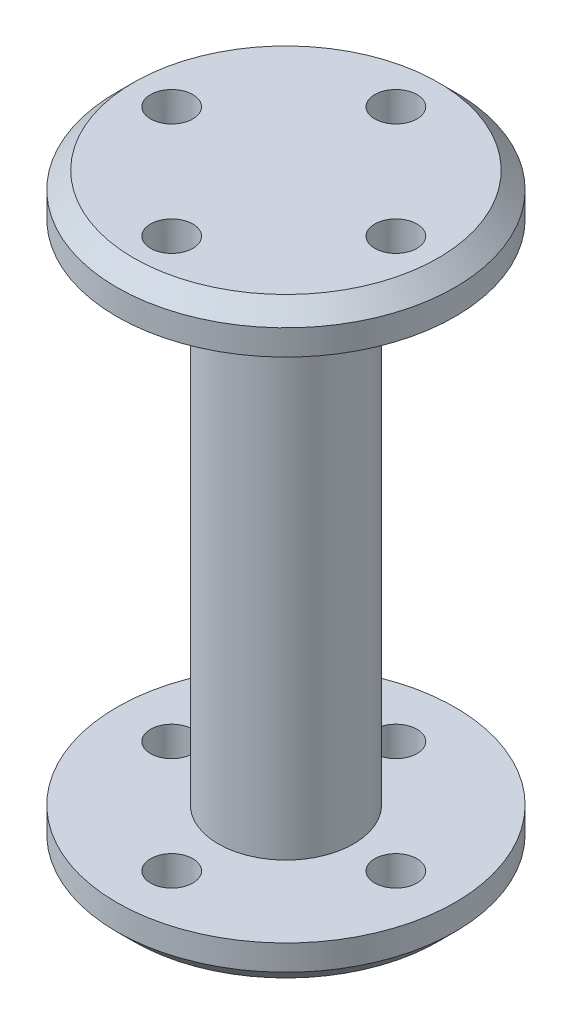
ISO-10303-21;
HEADER;
FILE_DESCRIPTION(('STEP AP214'),'2;1');
FILE_NAME('part.step','',(''),(''),'','','');
FILE_SCHEMA(('AUTOMOTIVE_DESIGN { 1 0 10303 214 1 1 1 1 }'));
ENDSEC;
DATA;
#1=APPLICATION_CONTEXT('core data for automotive mechanical design processes');
#2=APPLICATION_PROTOCOL_DEFINITION('international standard','automotive_design',2000,#1);
#3=PRODUCT_CONTEXT('',#1,'mechanical');
#4=PRODUCT('Part','Part','',(#3));
#5=PRODUCT_RELATED_PRODUCT_CATEGORY('part','',(#4));
#6=PRODUCT_DEFINITION_FORMATION('','',#4);
#7=PRODUCT_DEFINITION_CONTEXT('part definition',#1,'design');
#8=PRODUCT_DEFINITION('design','',#6,#7);
#9=PRODUCT_DEFINITION_SHAPE('','',#8);
#10=(LENGTH_UNIT() NAMED_UNIT(*) SI_UNIT(.MILLI.,.METRE.));
#11=(NAMED_UNIT(*) PLANE_ANGLE_UNIT() SI_UNIT($,.RADIAN.));
#12=(NAMED_UNIT(*) SI_UNIT($,.STERADIAN.) SOLID_ANGLE_UNIT());
#13=UNCERTAINTY_MEASURE_WITH_UNIT(LENGTH_MEASURE(1.E-05),#10,'distance_accuracy_value','');
#14=(GEOMETRIC_REPRESENTATION_CONTEXT(3) GLOBAL_UNCERTAINTY_ASSIGNED_CONTEXT((#13)) GLOBAL_UNIT_ASSIGNED_CONTEXT((#10,
#11,#12)) REPRESENTATION_CONTEXT('',''));
#15=CARTESIAN_POINT('',(0.,0.,0.));
#16=DIRECTION('',(0.,0.,1.));
#17=DIRECTION('',(1.,0.,0.));
#18=AXIS2_PLACEMENT_3D('',#15,#16,#17);
#19=CARTESIAN_POINT('',(0.,30.,0.));
#20=DIRECTION('',(0.,-1.,0.));
#21=DIRECTION('',(0.,0.,-1.));
#22=AXIS2_PLACEMENT_3D('',#19,#20,#21);
#23=CYLINDRICAL_SURFACE('',#22,8.);
#24=CARTESIAN_POINT('',(0.,30.,0.));
#25=DIRECTION('',(0.,1.,0.));
#26=DIRECTION('',(0.,0.,1.));
#27=AXIS2_PLACEMENT_3D('',#24,#25,#26);
#28=CIRCLE('',#27,8.);
#29=CARTESIAN_POINT('',(0.,30.,8.));
#30=VERTEX_POINT('',#29);
#31=EDGE_CURVE('E52',#30,#30,#28,.T.);
#32=ORIENTED_EDGE('',*,*,#31,.F.);
#33=EDGE_LOOP('',(#32));
#34=FACE_BOUND('',#33,.T.);
#35=CARTESIAN_POINT('',(0.,-30.,0.));
#36=DIRECTION('',(0.,1.,0.));
#37=DIRECTION('',(0.,0.,1.));
#38=AXIS2_PLACEMENT_3D('',#35,#36,#37);
#39=CIRCLE('',#38,8.);
#40=CARTESIAN_POINT('',(0.,-30.,8.));
#41=VERTEX_POINT('',#40);
#42=EDGE_CURVE('E98',#41,#41,#39,.T.);
#43=ORIENTED_EDGE('',*,*,#42,.T.);
#44=EDGE_LOOP('',(#43));
#45=FACE_BOUND('',#44,.T.);
#46=ADVANCED_FACE('F37',(#34,#45),#23,.T.);
#47=CARTESIAN_POINT('',(0.,35.,0.));
#48=DIRECTION('',(0.,-1.,0.));
#49=DIRECTION('',(0.,0.,-1.));
#50=AXIS2_PLACEMENT_3D('',#47,#48,#49);
#51=CYLINDRICAL_SURFACE('',#50,20.);
#52=CARTESIAN_POINT('',(0.,33.,0.));
#53=DIRECTION('',(0.,1.,0.));
#54=DIRECTION('',(0.,0.,1.));
#55=AXIS2_PLACEMENT_3D('',#52,#53,#54);
#56=CIRCLE('',#55,20.);
#57=CARTESIAN_POINT('',(0.,33.,20.));
#58=VERTEX_POINT('',#57);
#59=EDGE_CURVE('E10',#58,#58,#56,.F.);
#60=ORIENTED_EDGE('',*,*,#59,.T.);
#61=EDGE_LOOP('',(#60));
#62=FACE_BOUND('',#61,.T.);
#63=CARTESIAN_POINT('',(0.,30.,0.));
#64=DIRECTION('',(0.,1.,0.));
#65=DIRECTION('',(0.,0.,1.));
#66=AXIS2_PLACEMENT_3D('',#63,#64,#65);
#67=CIRCLE('',#66,20.);
#68=CARTESIAN_POINT('',(0.,30.,20.));
#69=VERTEX_POINT('',#68);
#70=EDGE_CURVE('E60',#69,#69,#67,.T.);
#71=ORIENTED_EDGE('',*,*,#70,.T.);
#72=EDGE_LOOP('',(#71));
#73=FACE_BOUND('',#72,.T.);
#74=ADVANCED_FACE('F95',(#62,#73),#51,.T.);
#75=CARTESIAN_POINT('',(0.,35.,0.));
#76=DIRECTION('',(0.,1.,0.));
#77=DIRECTION('',(0.,0.,1.));
#78=AXIS2_PLACEMENT_3D('',#75,#76,#77);
#79=PLANE('',#78);
#80=CARTESIAN_POINT('',(-13.2557041699449,35.,0.255704169944971));
#81=DIRECTION('',(0.,1.,0.));
#82=DIRECTION('',(1.,0.,0.));
#83=AXIS2_PLACEMENT_3D('',#80,#81,#82);
#84=CIRCLE('',#83,2.5);
#85=CARTESIAN_POINT('',(-10.7557041699449,35.,0.255704169944962));
#86=VERTEX_POINT('',#85);
#87=EDGE_CURVE('E66',#86,#86,#84,.T.);
#88=ORIENTED_EDGE('',*,*,#87,.F.);
#89=EDGE_LOOP('',(#88));
#90=FACE_BOUND('',#89,.T.);
#91=CARTESIAN_POINT('',(0.,35.,13.5114083398898));
#92=DIRECTION('',(0.,1.,0.));
#93=DIRECTION('',(0.,0.,-1.));
#94=AXIS2_PLACEMENT_3D('',#91,#92,#93);
#95=CIRCLE('',#94,2.5);
#96=CARTESIAN_POINT('',(0.,35.,11.0114083398898));
#97=VERTEX_POINT('',#96);
#98=EDGE_CURVE('E136',#97,#97,#95,.T.);
#99=ORIENTED_EDGE('',*,*,#98,.F.);
#100=EDGE_LOOP('',(#99));
#101=FACE_BOUND('',#100,.T.);
#102=CARTESIAN_POINT('',(13.2557041699449,35.,0.25570416994479));
#103=DIRECTION('',(0.,1.,0.));
#104=DIRECTION('',(-1.,0.,0.));
#105=AXIS2_PLACEMENT_3D('',#102,#103,#104);
#106=CIRCLE('',#105,2.5);
#107=CARTESIAN_POINT('',(10.7557041699449,35.,0.255704169944816));
#108=VERTEX_POINT('',#107);
#109=EDGE_CURVE('E82',#108,#108,#106,.T.);
#110=ORIENTED_EDGE('',*,*,#109,.F.);
#111=EDGE_LOOP('',(#110));
#112=FACE_BOUND('',#111,.T.);
#113=CARTESIAN_POINT('',(0.,35.,-13.));
#114=DIRECTION('',(0.,1.,0.));
#115=DIRECTION('',(0.,0.,1.));
#116=AXIS2_PLACEMENT_3D('',#113,#114,#115);
#117=CIRCLE('',#116,2.5);
#118=CARTESIAN_POINT('',(0.,35.,-10.5));
#119=VERTEX_POINT('',#118);
#120=EDGE_CURVE('E61',#119,#119,#117,.T.);
#121=ORIENTED_EDGE('',*,*,#120,.F.);
#122=EDGE_LOOP('',(#121));
#123=FACE_BOUND('',#122,.T.);
#124=CARTESIAN_POINT('',(0.,35.,0.));
#125=DIRECTION('',(0.,1.,0.));
#126=DIRECTION('',(0.,0.,1.));
#127=AXIS2_PLACEMENT_3D('',#124,#125,#126);
#128=CIRCLE('',#127,18.);
#129=CARTESIAN_POINT('',(0.,35.,18.));
#130=VERTEX_POINT('',#129);
#131=EDGE_CURVE('E46',#130,#130,#128,.T.);
#132=ORIENTED_EDGE('',*,*,#131,.T.);
#133=EDGE_LOOP('',(#132));
#134=FACE_BOUND('',#133,.T.);
#135=ADVANCED_FACE('F148',(#90,#101,#112,#123,#134),#79,.T.);
#136=CARTESIAN_POINT('',(0.,30.,0.));
#137=DIRECTION('',(0.,1.,0.));
#138=DIRECTION('',(0.,0.,1.));
#139=AXIS2_PLACEMENT_3D('',#136,#137,#138);
#140=PLANE('',#139);
#141=CARTESIAN_POINT('',(-13.2557041699449,30.,0.255704169944971));
#142=DIRECTION('',(0.,1.,0.));
#143=DIRECTION('',(0.,0.,1.));
#144=AXIS2_PLACEMENT_3D('',#141,#142,#143);
#145=CIRCLE('',#144,2.5);
#146=CARTESIAN_POINT('',(-13.2557041699449,30.,2.75570416994498));
#147=VERTEX_POINT('',#146);
#148=EDGE_CURVE('E41',#147,#147,#145,.T.);
#149=ORIENTED_EDGE('',*,*,#148,.T.);
#150=EDGE_LOOP('',(#149));
#151=FACE_BOUND('',#150,.T.);
#152=CARTESIAN_POINT('',(0.,30.,13.5114083398898));
#153=DIRECTION('',(0.,1.,0.));
#154=DIRECTION('',(0.,0.,1.));
#155=AXIS2_PLACEMENT_3D('',#152,#153,#154);
#156=CIRCLE('',#155,2.5);
#157=CARTESIAN_POINT('',(0.,30.,16.0114083398898));
#158=VERTEX_POINT('',#157);
#159=EDGE_CURVE('E65',#158,#158,#156,.T.);
#160=ORIENTED_EDGE('',*,*,#159,.T.);
#161=EDGE_LOOP('',(#160));
#162=FACE_BOUND('',#161,.T.);
#163=CARTESIAN_POINT('',(13.2557041699449,30.,0.25570416994479));
#164=DIRECTION('',(0.,1.,0.));
#165=DIRECTION('',(0.,0.,1.));
#166=AXIS2_PLACEMENT_3D('',#163,#164,#165);
#167=CIRCLE('',#166,2.5);
#168=CARTESIAN_POINT('',(13.2557041699449,30.,2.75570416994479));
#169=VERTEX_POINT('',#168);
#170=EDGE_CURVE('E62',#169,#169,#167,.T.);
#171=ORIENTED_EDGE('',*,*,#170,.T.);
#172=EDGE_LOOP('',(#171));
#173=FACE_BOUND('',#172,.T.);
#174=CARTESIAN_POINT('',(0.,30.,-13.));
#175=DIRECTION('',(0.,1.,0.));
#176=DIRECTION('',(0.,0.,1.));
#177=AXIS2_PLACEMENT_3D('',#174,#175,#176);
#178=CIRCLE('',#177,2.5);
#179=CARTESIAN_POINT('',(0.,30.,-10.5));
#180=VERTEX_POINT('',#179);
#181=EDGE_CURVE('E56',#180,#180,#178,.T.);
#182=ORIENTED_EDGE('',*,*,#181,.T.);
#183=EDGE_LOOP('',(#182));
#184=FACE_BOUND('',#183,.T.);
#185=ORIENTED_EDGE('',*,*,#31,.T.);
#186=EDGE_LOOP('',(#185));
#187=FACE_BOUND('',#186,.T.);
#188=ORIENTED_EDGE('',*,*,#70,.F.);
#189=EDGE_LOOP('',(#188));
#190=FACE_BOUND('',#189,.T.);
#191=ADVANCED_FACE('F90',(#151,#162,#173,#184,#187,#190),#140,.F.);
#192=CARTESIAN_POINT('',(0.,35.,0.));
#193=DIRECTION('',(0.,-1.,0.));
#194=DIRECTION('',(0.,0.,-1.));
#195=AXIS2_PLACEMENT_3D('',#192,#193,#194);
#196=CONICAL_SURFACE('',#195,18.,0.785398163397447);
#197=ORIENTED_EDGE('',*,*,#59,.F.);
#198=EDGE_LOOP('',(#197));
#199=FACE_BOUND('',#198,.T.);
#200=ORIENTED_EDGE('',*,*,#131,.F.);
#201=EDGE_LOOP('',(#200));
#202=FACE_BOUND('',#201,.T.);
#203=ADVANCED_FACE('F39',(#199,#202),#196,.T.);
#204=CARTESIAN_POINT('',(0.,-30.,-13.));
#205=DIRECTION('',(0.,1.,0.));
#206=DIRECTION('',(0.,0.,1.));
#207=AXIS2_PLACEMENT_3D('',#204,#205,#206);
#208=CYLINDRICAL_SURFACE('',#207,2.5);
#209=ORIENTED_EDGE('',*,*,#120,.T.);
#210=EDGE_LOOP('',(#209));
#211=FACE_BOUND('',#210,.T.);
#212=ORIENTED_EDGE('',*,*,#181,.F.);
#213=EDGE_LOOP('',(#212));
#214=FACE_BOUND('',#213,.T.);
#215=ADVANCED_FACE('F157',(#211,#214),#208,.F.);
#216=CARTESIAN_POINT('',(13.2557041699449,-30.,0.25570416994479));
#217=DIRECTION('',(0.,1.,0.));
#218=DIRECTION('',(0.,0.,1.));
#219=AXIS2_PLACEMENT_3D('',#216,#217,#218);
#220=CYLINDRICAL_SURFACE('',#219,2.5);
#221=ORIENTED_EDGE('',*,*,#109,.T.);
#222=EDGE_LOOP('',(#221));
#223=FACE_BOUND('',#222,.T.);
#224=ORIENTED_EDGE('',*,*,#170,.F.);
#225=EDGE_LOOP('',(#224));
#226=FACE_BOUND('',#225,.T.);
#227=ADVANCED_FACE('F145',(#223,#226),#220,.F.);
#228=CARTESIAN_POINT('',(0.,-30.,13.5114083398898));
#229=DIRECTION('',(0.,1.,0.));
#230=DIRECTION('',(0.,0.,1.));
#231=AXIS2_PLACEMENT_3D('',#228,#229,#230);
#232=CYLINDRICAL_SURFACE('',#231,2.5);
#233=ORIENTED_EDGE('',*,*,#98,.T.);
#234=EDGE_LOOP('',(#233));
#235=FACE_BOUND('',#234,.T.);
#236=ORIENTED_EDGE('',*,*,#159,.F.);
#237=EDGE_LOOP('',(#236));
#238=FACE_BOUND('',#237,.T.);
#239=ADVANCED_FACE('F199',(#235,#238),#232,.F.);
#240=CARTESIAN_POINT('',(-13.2557041699449,-30.,0.255704169944971));
#241=DIRECTION('',(0.,1.,0.));
#242=DIRECTION('',(0.,0.,1.));
#243=AXIS2_PLACEMENT_3D('',#240,#241,#242);
#244=CYLINDRICAL_SURFACE('',#243,2.5);
#245=ORIENTED_EDGE('',*,*,#87,.T.);
#246=EDGE_LOOP('',(#245));
#247=FACE_BOUND('',#246,.T.);
#248=ORIENTED_EDGE('',*,*,#148,.F.);
#249=EDGE_LOOP('',(#248));
#250=FACE_BOUND('',#249,.T.);
#251=ADVANCED_FACE('F208',(#247,#250),#244,.F.);
#252=CARTESIAN_POINT('',(0.,-35.,0.));
#253=DIRECTION('',(0.,1.,0.));
#254=DIRECTION('',(0.,0.,-1.));
#255=AXIS2_PLACEMENT_3D('',#252,#253,#254);
#256=CYLINDRICAL_SURFACE('',#255,20.);
#257=CARTESIAN_POINT('',(0.,-33.,0.));
#258=DIRECTION('',(0.,1.,0.));
#259=DIRECTION('',(0.,0.,1.));
#260=AXIS2_PLACEMENT_3D('',#257,#258,#259);
#261=CIRCLE('',#260,20.);
#262=CARTESIAN_POINT('',(0.,-33.,20.));
#263=VERTEX_POINT('',#262);
#264=EDGE_CURVE('E107',#263,#263,#261,.F.);
#265=ORIENTED_EDGE('',*,*,#264,.F.);
#266=EDGE_LOOP('',(#265));
#267=FACE_BOUND('',#266,.T.);
#268=CARTESIAN_POINT('',(0.,-30.,0.));
#269=DIRECTION('',(0.,1.,0.));
#270=DIRECTION('',(0.,0.,1.));
#271=AXIS2_PLACEMENT_3D('',#268,#269,#270);
#272=CIRCLE('',#271,20.);
#273=CARTESIAN_POINT('',(0.,-30.,20.));
#274=VERTEX_POINT('',#273);
#275=EDGE_CURVE('E102',#274,#274,#272,.T.);
#276=ORIENTED_EDGE('',*,*,#275,.F.);
#277=EDGE_LOOP('',(#276));
#278=FACE_BOUND('',#277,.T.);
#279=ADVANCED_FACE('F216',(#267,#278),#256,.T.);
#280=CARTESIAN_POINT('',(0.,-35.,0.));
#281=DIRECTION('',(0.,-1.,0.));
#282=DIRECTION('',(0.,0.,1.));
#283=AXIS2_PLACEMENT_3D('',#280,#281,#282);
#284=PLANE('',#283);
#285=CARTESIAN_POINT('',(-13.2557041699449,-35.,0.255704169944971));
#286=DIRECTION('',(0.,1.,0.));
#287=DIRECTION('',(1.,0.,0.));
#288=AXIS2_PLACEMENT_3D('',#285,#286,#287);
#289=CIRCLE('',#288,2.5);
#290=CARTESIAN_POINT('',(-10.7557041699449,-35.,0.255704169944962));
#291=VERTEX_POINT('',#290);
#292=EDGE_CURVE('E126',#291,#291,#289,.T.);
#293=ORIENTED_EDGE('',*,*,#292,.T.);
#294=EDGE_LOOP('',(#293));
#295=FACE_BOUND('',#294,.T.);
#296=CARTESIAN_POINT('',(0.,-35.,13.5114083398898));
#297=DIRECTION('',(0.,1.,0.));
#298=DIRECTION('',(0.,0.,-1.));
#299=AXIS2_PLACEMENT_3D('',#296,#297,#298);
#300=CIRCLE('',#299,2.5);
#301=CARTESIAN_POINT('',(0.,-35.,11.0114083398898));
#302=VERTEX_POINT('',#301);
#303=EDGE_CURVE('E321',#302,#302,#300,.T.);
#304=ORIENTED_EDGE('',*,*,#303,.T.);
#305=EDGE_LOOP('',(#304));
#306=FACE_BOUND('',#305,.T.);
#307=CARTESIAN_POINT('',(13.2557041699449,-35.,0.25570416994479));
#308=DIRECTION('',(0.,1.,0.));
#309=DIRECTION('',(-1.,0.,0.));
#310=AXIS2_PLACEMENT_3D('',#307,#308,#309);
#311=CIRCLE('',#310,2.5);
#312=CARTESIAN_POINT('',(10.7557041699449,-35.,0.255704169944816));
#313=VERTEX_POINT('',#312);
#314=EDGE_CURVE('E325',#313,#313,#311,.T.);
#315=ORIENTED_EDGE('',*,*,#314,.T.);
#316=EDGE_LOOP('',(#315));
#317=FACE_BOUND('',#316,.T.);
#318=CARTESIAN_POINT('',(0.,-35.,-13.));
#319=DIRECTION('',(0.,1.,0.));
#320=DIRECTION('',(0.,0.,1.));
#321=AXIS2_PLACEMENT_3D('',#318,#319,#320);
#322=CIRCLE('',#321,2.5);
#323=CARTESIAN_POINT('',(0.,-35.,-10.5));
#324=VERTEX_POINT('',#323);
#325=EDGE_CURVE('E120',#324,#324,#322,.T.);
#326=ORIENTED_EDGE('',*,*,#325,.T.);
#327=EDGE_LOOP('',(#326));
#328=FACE_BOUND('',#327,.T.);
#329=CARTESIAN_POINT('',(0.,-35.,0.));
#330=DIRECTION('',(0.,1.,0.));
#331=DIRECTION('',(0.,0.,1.));
#332=AXIS2_PLACEMENT_3D('',#329,#330,#331);
#333=CIRCLE('',#332,18.);
#334=CARTESIAN_POINT('',(0.,-35.,18.));
#335=VERTEX_POINT('',#334);
#336=EDGE_CURVE('E101',#335,#335,#333,.T.);
#337=ORIENTED_EDGE('',*,*,#336,.F.);
#338=EDGE_LOOP('',(#337));
#339=FACE_BOUND('',#338,.T.);
#340=ADVANCED_FACE('F231',(#295,#306,#317,#328,#339),#284,.T.);
#341=CARTESIAN_POINT('',(0.,-30.,0.));
#342=DIRECTION('',(0.,-1.,0.));
#343=DIRECTION('',(0.,0.,1.));
#344=AXIS2_PLACEMENT_3D('',#341,#342,#343);
#345=PLANE('',#344);
#346=CARTESIAN_POINT('',(-13.2557041699449,-30.,0.255704169944971));
#347=DIRECTION('',(0.,1.,0.));
#348=DIRECTION('',(0.,0.,1.));
#349=AXIS2_PLACEMENT_3D('',#346,#347,#348);
#350=CIRCLE('',#349,2.5);
#351=CARTESIAN_POINT('',(-13.2557041699449,-30.,2.75570416994498));
#352=VERTEX_POINT('',#351);
#353=EDGE_CURVE('E130',#352,#352,#350,.T.);
#354=ORIENTED_EDGE('',*,*,#353,.F.);
#355=EDGE_LOOP('',(#354));
#356=FACE_BOUND('',#355,.T.);
#357=CARTESIAN_POINT('',(0.,-30.,13.5114083398898));
#358=DIRECTION('',(0.,1.,0.));
#359=DIRECTION('',(0.,0.,1.));
#360=AXIS2_PLACEMENT_3D('',#357,#358,#359);
#361=CIRCLE('',#360,2.5);
#362=CARTESIAN_POINT('',(0.,-30.,16.0114083398898));
#363=VERTEX_POINT('',#362);
#364=EDGE_CURVE('E125',#363,#363,#361,.T.);
#365=ORIENTED_EDGE('',*,*,#364,.F.);
#366=EDGE_LOOP('',(#365));
#367=FACE_BOUND('',#366,.T.);
#368=CARTESIAN_POINT('',(13.2557041699449,-30.,0.25570416994479));
#369=DIRECTION('',(0.,1.,0.));
#370=DIRECTION('',(0.,0.,1.));
#371=AXIS2_PLACEMENT_3D('',#368,#369,#370);
#372=CIRCLE('',#371,2.5);
#373=CARTESIAN_POINT('',(13.2557041699449,-30.,2.75570416994479));
#374=VERTEX_POINT('',#373);
#375=EDGE_CURVE('E121',#374,#374,#372,.T.);
#376=ORIENTED_EDGE('',*,*,#375,.F.);
#377=EDGE_LOOP('',(#376));
#378=FACE_BOUND('',#377,.T.);
#379=CARTESIAN_POINT('',(0.,-30.,-13.));
#380=DIRECTION('',(0.,1.,0.));
#381=DIRECTION('',(0.,0.,1.));
#382=AXIS2_PLACEMENT_3D('',#379,#380,#381);
#383=CIRCLE('',#382,2.5);
#384=CARTESIAN_POINT('',(0.,-30.,-10.5));
#385=VERTEX_POINT('',#384);
#386=EDGE_CURVE('E110',#385,#385,#383,.T.);
#387=ORIENTED_EDGE('',*,*,#386,.F.);
#388=EDGE_LOOP('',(#387));
#389=FACE_BOUND('',#388,.T.);
#390=ORIENTED_EDGE('',*,*,#42,.F.);
#391=EDGE_LOOP('',(#390));
#392=FACE_BOUND('',#391,.T.);
#393=ORIENTED_EDGE('',*,*,#275,.T.);
#394=EDGE_LOOP('',(#393));
#395=FACE_BOUND('',#394,.T.);
#396=ADVANCED_FACE('F240',(#356,#367,#378,#389,#392,#395),#345,.F.);
#397=CARTESIAN_POINT('',(0.,-35.,0.));
#398=DIRECTION('',(0.,1.,0.));
#399=DIRECTION('',(0.,0.,-1.));
#400=AXIS2_PLACEMENT_3D('',#397,#398,#399);
#401=CONICAL_SURFACE('',#400,18.,0.785398163397447);
#402=ORIENTED_EDGE('',*,*,#264,.T.);
#403=EDGE_LOOP('',(#402));
#404=FACE_BOUND('',#403,.T.);
#405=ORIENTED_EDGE('',*,*,#336,.T.);
#406=EDGE_LOOP('',(#405));
#407=FACE_BOUND('',#406,.T.);
#408=ADVANCED_FACE('F249',(#404,#407),#401,.T.);
#409=CARTESIAN_POINT('',(0.,30.,-13.));
#410=DIRECTION('',(0.,-1.,0.));
#411=DIRECTION('',(0.,0.,1.));
#412=AXIS2_PLACEMENT_3D('',#409,#410,#411);
#413=CYLINDRICAL_SURFACE('',#412,2.5);
#414=ORIENTED_EDGE('',*,*,#325,.F.);
#415=EDGE_LOOP('',(#414));
#416=FACE_BOUND('',#415,.T.);
#417=ORIENTED_EDGE('',*,*,#386,.T.);
#418=EDGE_LOOP('',(#417));
#419=FACE_BOUND('',#418,.T.);
#420=ADVANCED_FACE('F258',(#416,#419),#413,.F.);
#421=CARTESIAN_POINT('',(13.2557041699449,30.,0.25570416994479));
#422=DIRECTION('',(0.,-1.,0.));
#423=DIRECTION('',(0.,0.,1.));
#424=AXIS2_PLACEMENT_3D('',#421,#422,#423);
#425=CYLINDRICAL_SURFACE('',#424,2.5);
#426=ORIENTED_EDGE('',*,*,#314,.F.);
#427=EDGE_LOOP('',(#426));
#428=FACE_BOUND('',#427,.T.);
#429=ORIENTED_EDGE('',*,*,#375,.T.);
#430=EDGE_LOOP('',(#429));
#431=FACE_BOUND('',#430,.T.);
#432=ADVANCED_FACE('F267',(#428,#431),#425,.F.);
#433=CARTESIAN_POINT('',(0.,30.,13.5114083398898));
#434=DIRECTION('',(0.,-1.,0.));
#435=DIRECTION('',(0.,0.,1.));
#436=AXIS2_PLACEMENT_3D('',#433,#434,#435);
#437=CYLINDRICAL_SURFACE('',#436,2.5);
#438=ORIENTED_EDGE('',*,*,#303,.F.);
#439=EDGE_LOOP('',(#438));
#440=FACE_BOUND('',#439,.T.);
#441=ORIENTED_EDGE('',*,*,#364,.T.);
#442=EDGE_LOOP('',(#441));
#443=FACE_BOUND('',#442,.T.);
#444=ADVANCED_FACE('F276',(#440,#443),#437,.F.);
#445=CARTESIAN_POINT('',(-13.2557041699449,30.,0.255704169944971));
#446=DIRECTION('',(0.,-1.,0.));
#447=DIRECTION('',(0.,0.,1.));
#448=AXIS2_PLACEMENT_3D('',#445,#446,#447);
#449=CYLINDRICAL_SURFACE('',#448,2.5);
#450=ORIENTED_EDGE('',*,*,#292,.F.);
#451=EDGE_LOOP('',(#450));
#452=FACE_BOUND('',#451,.T.);
#453=ORIENTED_EDGE('',*,*,#353,.T.);
#454=EDGE_LOOP('',(#453));
#455=FACE_BOUND('',#454,.T.);
#456=ADVANCED_FACE('F285',(#452,#455),#449,.F.);
#457=CLOSED_SHELL('',(#46,#74,#135,#191,#203,#215,#227,#239,#251,#279,#340,#396,#408,#420,#432,
#444,#456));
#458=MANIFOLD_SOLID_BREP('B2',#457);
#459=ADVANCED_BREP_SHAPE_REPRESENTATION('',(#18,#458),#14);
#460=SHAPE_DEFINITION_REPRESENTATION(#9,#459);
ENDSEC;
END-ISO-10303-21;
